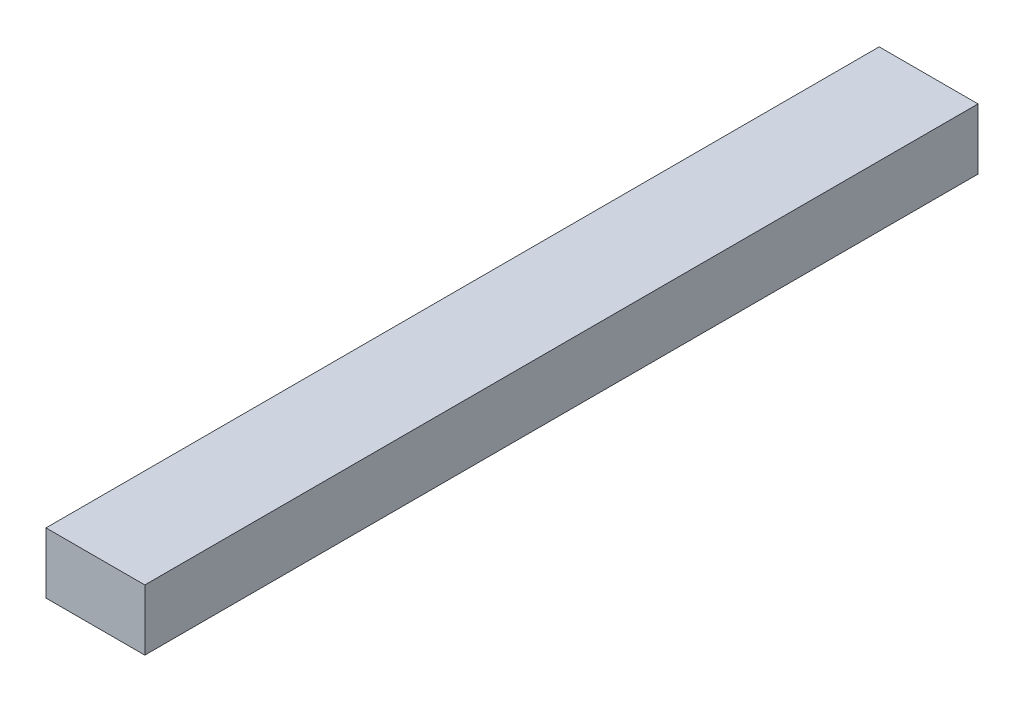
ISO-10303-21;
HEADER;
FILE_DESCRIPTION(('STEP AP214'),'2;1');
FILE_NAME('part.step','',(''),(''),'','','');
FILE_SCHEMA(('AUTOMOTIVE_DESIGN { 1 0 10303 214 1 1 1 1 }'));
ENDSEC;
DATA;
#1=APPLICATION_CONTEXT('core data for automotive mechanical design processes');
#2=APPLICATION_PROTOCOL_DEFINITION('international standard','automotive_design',2000,#1);
#3=PRODUCT_CONTEXT('',#1,'mechanical');
#4=PRODUCT('Part','Part','',(#3));
#5=PRODUCT_RELATED_PRODUCT_CATEGORY('part','',(#4));
#6=PRODUCT_DEFINITION_FORMATION('','',#4);
#7=PRODUCT_DEFINITION_CONTEXT('part definition',#1,'design');
#8=PRODUCT_DEFINITION('design','',#6,#7);
#9=PRODUCT_DEFINITION_SHAPE('','',#8);
#10=(LENGTH_UNIT() NAMED_UNIT(*) SI_UNIT(.MILLI.,.METRE.));
#11=(NAMED_UNIT(*) PLANE_ANGLE_UNIT() SI_UNIT($,.RADIAN.));
#12=(NAMED_UNIT(*) SI_UNIT($,.STERADIAN.) SOLID_ANGLE_UNIT());
#13=UNCERTAINTY_MEASURE_WITH_UNIT(LENGTH_MEASURE(1.E-05),#10,'distance_accuracy_value','');
#14=(GEOMETRIC_REPRESENTATION_CONTEXT(3) GLOBAL_UNCERTAINTY_ASSIGNED_CONTEXT((#13)) GLOBAL_UNIT_ASSIGNED_CONTEXT((#10,
#11,#12)) REPRESENTATION_CONTEXT('',''));
#15=CARTESIAN_POINT('',(0.,0.,0.));
#16=DIRECTION('',(0.,0.,1.));
#17=DIRECTION('',(1.,0.,0.));
#18=AXIS2_PLACEMENT_3D('',#15,#16,#17);
#19=CARTESIAN_POINT('',(-13.5927170731707,7.33719268292683,254.));
#20=DIRECTION('',(0.,1.,0.));
#21=DIRECTION('',(0.,0.,1.));
#22=AXIS2_PLACEMENT_3D('',#19,#20,#21);
#23=PLANE('',#22);
#24=DIRECTION('',(1.,0.,0.));
#25=VECTOR('',#24,1.);
#26=CARTESIAN_POINT('',(-13.5927170731707,7.33719268292683,0.));
#27=LINE('',#26,#25);
#28=CARTESIAN_POINT('',(-13.5927170731707,7.33719268292683,0.));
#29=VERTEX_POINT('',#28);
#30=CARTESIAN_POINT('',(16.5316829268293,7.33719268292683,0.));
#31=VERTEX_POINT('',#30);
#32=EDGE_CURVE('E98',#29,#31,#27,.T.);
#33=ORIENTED_EDGE('',*,*,#32,.F.);
#34=DIRECTION('',(0.,0.,-1.));
#35=VECTOR('',#34,1.);
#36=CARTESIAN_POINT('',(-13.5927170731707,7.33719268292683,254.));
#37=LINE('',#36,#35);
#38=CARTESIAN_POINT('',(-13.5927170731707,7.33719268292683,254.));
#39=VERTEX_POINT('',#38);
#40=EDGE_CURVE('E11',#39,#29,#37,.T.);
#41=ORIENTED_EDGE('',*,*,#40,.F.);
#42=DIRECTION('',(1.,0.,0.));
#43=VECTOR('',#42,1.);
#44=CARTESIAN_POINT('',(-13.5927170731707,7.33719268292683,254.));
#45=LINE('',#44,#43);
#46=CARTESIAN_POINT('',(16.5316829268293,7.33719268292683,254.));
#47=VERTEX_POINT('',#46);
#48=EDGE_CURVE('E93',#39,#47,#45,.T.);
#49=ORIENTED_EDGE('',*,*,#48,.T.);
#50=DIRECTION('',(0.,0.,-1.));
#51=VECTOR('',#50,1.);
#52=CARTESIAN_POINT('',(16.5316829268293,7.33719268292683,254.));
#53=LINE('',#52,#51);
#54=EDGE_CURVE('E36',#47,#31,#53,.T.);
#55=ORIENTED_EDGE('',*,*,#54,.T.);
#56=EDGE_LOOP('',(#33,#41,#49,#55));
#57=FACE_BOUND('',#56,.T.);
#58=ADVANCED_FACE('F33',(#57),#23,.T.);
#59=CARTESIAN_POINT('',(-13.5927170731707,7.33719268292683,254.));
#60=DIRECTION('',(1.,0.,0.));
#61=DIRECTION('',(0.,1.,0.));
#62=AXIS2_PLACEMENT_3D('',#59,#60,#61);
#63=PLANE('',#62);
#64=DIRECTION('',(0.,-1.,0.));
#65=VECTOR('',#64,1.);
#66=CARTESIAN_POINT('',(-13.5927170731707,7.33719268292683,0.));
#67=LINE('',#66,#65);
#68=CARTESIAN_POINT('',(-13.5927170731707,-11.2048073170732,0.));
#69=VERTEX_POINT('',#68);
#70=EDGE_CURVE('E66',#29,#69,#67,.T.);
#71=ORIENTED_EDGE('',*,*,#70,.T.);
#72=DIRECTION('',(0.,0.,-1.));
#73=VECTOR('',#72,1.);
#74=CARTESIAN_POINT('',(-13.5927170731707,-11.2048073170732,254.));
#75=LINE('',#74,#73);
#76=CARTESIAN_POINT('',(-13.5927170731707,-11.2048073170732,254.));
#77=VERTEX_POINT('',#76);
#78=EDGE_CURVE('E42',#77,#69,#75,.T.);
#79=ORIENTED_EDGE('',*,*,#78,.F.);
#80=DIRECTION('',(0.,-1.,0.));
#81=VECTOR('',#80,1.);
#82=CARTESIAN_POINT('',(-13.5927170731707,7.33719268292683,254.));
#83=LINE('',#82,#81);
#84=EDGE_CURVE('E83',#39,#77,#83,.T.);
#85=ORIENTED_EDGE('',*,*,#84,.F.);
#86=ORIENTED_EDGE('',*,*,#40,.T.);
#87=EDGE_LOOP('',(#71,#79,#85,#86));
#88=FACE_BOUND('',#87,.T.);
#89=ADVANCED_FACE('F108',(#88),#63,.F.);
#90=CARTESIAN_POINT('',(-13.5927170731707,-11.2048073170732,254.));
#91=DIRECTION('',(0.,1.,0.));
#92=DIRECTION('',(0.,0.,1.));
#93=AXIS2_PLACEMENT_3D('',#90,#91,#92);
#94=PLANE('',#93);
#95=DIRECTION('',(1.,0.,0.));
#96=VECTOR('',#95,1.);
#97=CARTESIAN_POINT('',(-13.5927170731707,-11.2048073170732,0.));
#98=LINE('',#97,#96);
#99=CARTESIAN_POINT('',(16.5316829268293,-11.2048073170732,0.));
#100=VERTEX_POINT('',#99);
#101=EDGE_CURVE('E90',#69,#100,#98,.T.);
#102=ORIENTED_EDGE('',*,*,#101,.T.);
#103=DIRECTION('',(0.,0.,-1.));
#104=VECTOR('',#103,1.);
#105=CARTESIAN_POINT('',(16.5316829268293,-11.2048073170732,254.));
#106=LINE('',#105,#104);
#107=CARTESIAN_POINT('',(16.5316829268293,-11.2048073170732,254.));
#108=VERTEX_POINT('',#107);
#109=EDGE_CURVE('E87',#108,#100,#106,.T.);
#110=ORIENTED_EDGE('',*,*,#109,.F.);
#111=DIRECTION('',(1.,0.,0.));
#112=VECTOR('',#111,1.);
#113=CARTESIAN_POINT('',(-13.5927170731707,-11.2048073170732,254.));
#114=LINE('',#113,#112);
#115=EDGE_CURVE('E78',#77,#108,#114,.T.);
#116=ORIENTED_EDGE('',*,*,#115,.F.);
#117=ORIENTED_EDGE('',*,*,#78,.T.);
#118=EDGE_LOOP('',(#102,#110,#116,#117));
#119=FACE_BOUND('',#118,.T.);
#120=ADVANCED_FACE('F88',(#119),#94,.F.);
#121=CARTESIAN_POINT('',(16.5316829268293,7.33719268292683,254.));
#122=DIRECTION('',(1.,0.,0.));
#123=DIRECTION('',(0.,0.,-1.));
#124=AXIS2_PLACEMENT_3D('',#121,#122,#123);
#125=PLANE('',#124);
#126=DIRECTION('',(0.,-1.,0.));
#127=VECTOR('',#126,1.);
#128=CARTESIAN_POINT('',(16.5316829268293,7.33719268292683,0.));
#129=LINE('',#128,#127);
#130=EDGE_CURVE('E101',#31,#100,#129,.T.);
#131=ORIENTED_EDGE('',*,*,#130,.F.);
#132=ORIENTED_EDGE('',*,*,#54,.F.);
#133=DIRECTION('',(0.,-1.,0.));
#134=VECTOR('',#133,1.);
#135=CARTESIAN_POINT('',(16.5316829268293,7.33719268292683,254.));
#136=LINE('',#135,#134);
#137=EDGE_CURVE('E82',#47,#108,#136,.T.);
#138=ORIENTED_EDGE('',*,*,#137,.T.);
#139=ORIENTED_EDGE('',*,*,#109,.T.);
#140=EDGE_LOOP('',(#131,#132,#138,#139));
#141=FACE_BOUND('',#140,.T.);
#142=ADVANCED_FACE('F92',(#141),#125,.T.);
#143=CARTESIAN_POINT('',(0.,0.,254.));
#144=DIRECTION('',(0.,0.,-1.));
#145=DIRECTION('',(-1.,0.,0.));
#146=AXIS2_PLACEMENT_3D('',#143,#144,#145);
#147=PLANE('',#146);
#148=ORIENTED_EDGE('',*,*,#48,.F.);
#149=ORIENTED_EDGE('',*,*,#84,.T.);
#150=ORIENTED_EDGE('',*,*,#115,.T.);
#151=ORIENTED_EDGE('',*,*,#137,.F.);
#152=EDGE_LOOP('',(#148,#149,#150,#151));
#153=FACE_BOUND('',#152,.T.);
#154=ADVANCED_FACE('F81',(#153),#147,.F.);
#155=CARTESIAN_POINT('',(0.,0.,0.));
#156=DIRECTION('',(0.,0.,-1.));
#157=DIRECTION('',(-1.,0.,0.));
#158=AXIS2_PLACEMENT_3D('',#155,#156,#157);
#159=PLANE('',#158);
#160=ORIENTED_EDGE('',*,*,#32,.T.);
#161=ORIENTED_EDGE('',*,*,#130,.T.);
#162=ORIENTED_EDGE('',*,*,#101,.F.);
#163=ORIENTED_EDGE('',*,*,#70,.F.);
#164=EDGE_LOOP('',(#160,#161,#162,#163));
#165=FACE_BOUND('',#164,.T.);
#166=ADVANCED_FACE('F106',(#165),#159,.T.);
#167=CLOSED_SHELL('',(#58,#89,#120,#142,#154,#166));
#168=MANIFOLD_SOLID_BREP('B2',#167);
#169=ADVANCED_BREP_SHAPE_REPRESENTATION('',(#18,#168),#14);
#170=SHAPE_DEFINITION_REPRESENTATION(#9,#169);
ENDSEC;
END-ISO-10303-21;
